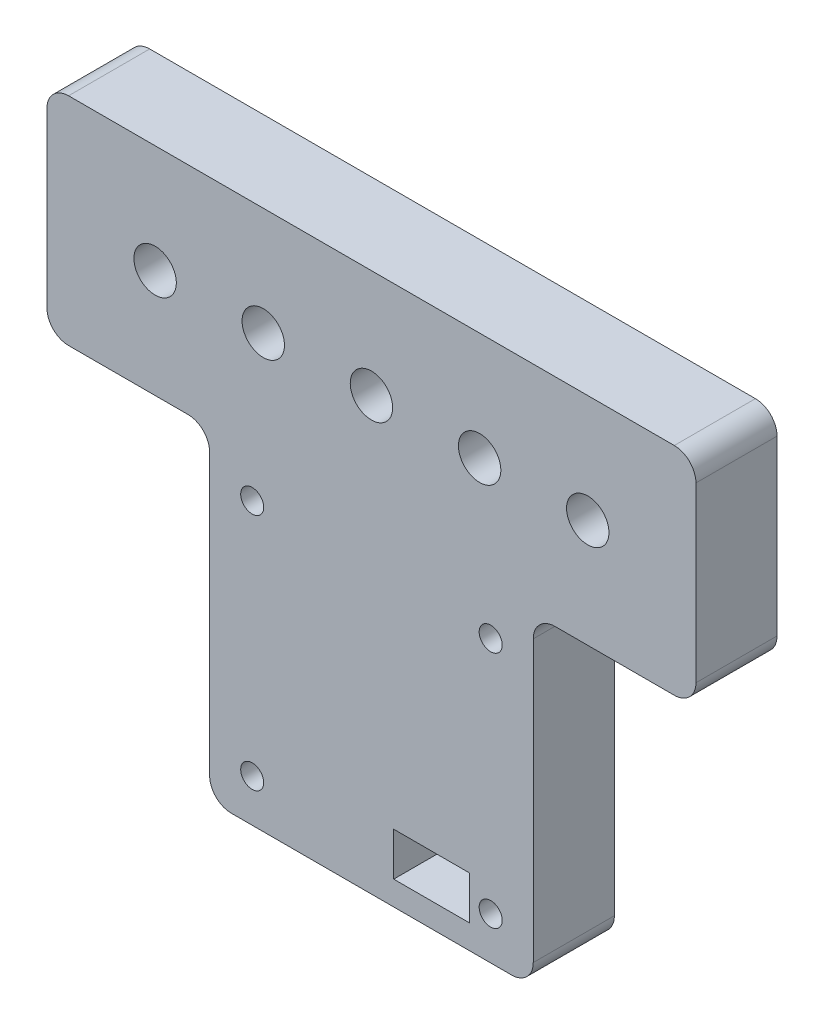
ISO-10303-21;
HEADER;
FILE_DESCRIPTION(('STEP AP214'),'2;1');
FILE_NAME('part.step','',(''),(''),'','','');
FILE_SCHEMA(('AUTOMOTIVE_DESIGN { 1 0 10303 214 1 1 1 1 }'));
ENDSEC;
DATA;
#1=APPLICATION_CONTEXT('core data for automotive mechanical design processes');
#2=APPLICATION_PROTOCOL_DEFINITION('international standard','automotive_design',2000,#1);
#3=PRODUCT_CONTEXT('',#1,'mechanical');
#4=PRODUCT('Part','Part','',(#3));
#5=PRODUCT_RELATED_PRODUCT_CATEGORY('part','',(#4));
#6=PRODUCT_DEFINITION_FORMATION('','',#4);
#7=PRODUCT_DEFINITION_CONTEXT('part definition',#1,'design');
#8=PRODUCT_DEFINITION('design','',#6,#7);
#9=PRODUCT_DEFINITION_SHAPE('','',#8);
#10=(LENGTH_UNIT() NAMED_UNIT(*) SI_UNIT(.MILLI.,.METRE.));
#11=(NAMED_UNIT(*) PLANE_ANGLE_UNIT() SI_UNIT($,.RADIAN.));
#12=(NAMED_UNIT(*) SI_UNIT($,.STERADIAN.) SOLID_ANGLE_UNIT());
#13=UNCERTAINTY_MEASURE_WITH_UNIT(LENGTH_MEASURE(1.E-05),#10,'distance_accuracy_value','');
#14=(GEOMETRIC_REPRESENTATION_CONTEXT(3) GLOBAL_UNCERTAINTY_ASSIGNED_CONTEXT((#13)) GLOBAL_UNIT_ASSIGNED_CONTEXT((#10,
#11,#12)) REPRESENTATION_CONTEXT('',''));
#15=CARTESIAN_POINT('',(0.,0.,0.));
#16=DIRECTION('',(0.,0.,1.));
#17=DIRECTION('',(1.,0.,0.));
#18=AXIS2_PLACEMENT_3D('',#15,#16,#17);
#19=CARTESIAN_POINT('',(0.,0.,0.));
#20=DIRECTION('',(0.,0.,-1.));
#21=DIRECTION('',(-1.,0.,0.));
#22=AXIS2_PLACEMENT_3D('',#19,#20,#21);
#23=PLANE('',#22);
#24=CARTESIAN_POINT('',(-25.4,31.7,0.));
#25=DIRECTION('',(0.,0.,-1.));
#26=DIRECTION('',(-1.,0.,0.));
#27=AXIS2_PLACEMENT_3D('',#24,#25,#26);
#28=CIRCLE('',#27,2.4892);
#29=CARTESIAN_POINT('',(-27.8892,31.7,0.));
#30=VERTEX_POINT('',#29);
#31=EDGE_CURVE('E523',#30,#30,#28,.T.);
#32=ORIENTED_EDGE('',*,*,#31,.F.);
#33=EDGE_LOOP('',(#32));
#34=FACE_BOUND('',#33,.T.);
#35=CARTESIAN_POINT('',(-12.7,31.7,0.));
#36=DIRECTION('',(0.,0.,-1.));
#37=DIRECTION('',(-1.,0.,0.));
#38=AXIS2_PLACEMENT_3D('',#35,#36,#37);
#39=CIRCLE('',#38,2.4892);
#40=CARTESIAN_POINT('',(-15.1892,31.7,0.));
#41=VERTEX_POINT('',#40);
#42=EDGE_CURVE('E515',#41,#41,#39,.T.);
#43=ORIENTED_EDGE('',*,*,#42,.F.);
#44=EDGE_LOOP('',(#43));
#45=FACE_BOUND('',#44,.T.);
#46=CARTESIAN_POINT('',(0.,31.7,0.));
#47=DIRECTION('',(0.,0.,-1.));
#48=DIRECTION('',(-1.,0.,0.));
#49=AXIS2_PLACEMENT_3D('',#46,#47,#48);
#50=CIRCLE('',#49,2.4892);
#51=CARTESIAN_POINT('',(-2.48919999999999,31.7,0.));
#52=VERTEX_POINT('',#51);
#53=EDGE_CURVE('E507',#52,#52,#50,.T.);
#54=ORIENTED_EDGE('',*,*,#53,.F.);
#55=EDGE_LOOP('',(#54));
#56=FACE_BOUND('',#55,.T.);
#57=CARTESIAN_POINT('',(12.7,31.7,0.));
#58=DIRECTION('',(0.,0.,-1.));
#59=DIRECTION('',(-1.,0.,0.));
#60=AXIS2_PLACEMENT_3D('',#57,#58,#59);
#61=CIRCLE('',#60,2.4892);
#62=CARTESIAN_POINT('',(10.2108,31.7,0.));
#63=VERTEX_POINT('',#62);
#64=EDGE_CURVE('E499',#63,#63,#61,.T.);
#65=ORIENTED_EDGE('',*,*,#64,.F.);
#66=EDGE_LOOP('',(#65));
#67=FACE_BOUND('',#66,.T.);
#68=CARTESIAN_POINT('',(25.4,31.7,0.));
#69=DIRECTION('',(0.,0.,-1.));
#70=DIRECTION('',(-1.,0.,0.));
#71=AXIS2_PLACEMENT_3D('',#68,#69,#70);
#72=CIRCLE('',#71,2.4892);
#73=CARTESIAN_POINT('',(22.9108,31.7,0.));
#74=VERTEX_POINT('',#73);
#75=EDGE_CURVE('E451',#74,#74,#72,.T.);
#76=ORIENTED_EDGE('',*,*,#75,.F.);
#77=EDGE_LOOP('',(#76));
#78=FACE_BOUND('',#77,.T.);
#79=DIRECTION('',(0.,-1.,0.));
#80=VECTOR('',#79,1.);
#81=CARTESIAN_POINT('',(11.50499991,-11.089999978,0.));
#82=LINE('',#81,#80);
#83=CARTESIAN_POINT('',(11.50499991,-11.089999978,0.));
#84=VERTEX_POINT('',#83);
#85=CARTESIAN_POINT('',(11.50499991,-16.169999978,0.));
#86=VERTEX_POINT('',#85);
#87=EDGE_CURVE('E191',#84,#86,#82,.T.);
#88=ORIENTED_EDGE('',*,*,#87,.F.);
#89=DIRECTION('',(1.,0.,0.));
#90=VECTOR('',#89,1.);
#91=CARTESIAN_POINT('',(2.61499991,-11.089999978,0.));
#92=LINE('',#91,#90);
#93=CARTESIAN_POINT('',(2.61499991,-11.089999978,0.));
#94=VERTEX_POINT('',#93);
#95=EDGE_CURVE('E212',#94,#84,#92,.T.);
#96=ORIENTED_EDGE('',*,*,#95,.F.);
#97=DIRECTION('',(0.,1.,0.));
#98=VECTOR('',#97,1.);
#99=CARTESIAN_POINT('',(2.61499991,-11.089999978,0.));
#100=LINE('',#99,#98);
#101=CARTESIAN_POINT('',(2.61499991,-16.169999978,0.));
#102=VERTEX_POINT('',#101);
#103=EDGE_CURVE('E216',#102,#94,#100,.T.);
#104=ORIENTED_EDGE('',*,*,#103,.F.);
#105=DIRECTION('',(-1.,0.,0.));
#106=VECTOR('',#105,1.);
#107=CARTESIAN_POINT('',(2.61499991,-16.169999978,0.));
#108=LINE('',#107,#106);
#109=EDGE_CURVE('E228',#86,#102,#108,.T.);
#110=ORIENTED_EDGE('',*,*,#109,.F.);
#111=EDGE_LOOP('',(#88,#96,#104,#110));
#112=FACE_BOUND('',#111,.T.);
#113=DIRECTION('',(0.,-1.,0.));
#114=VECTOR('',#113,1.);
#115=CARTESIAN_POINT('',(-38.1,44.4,0.));
#116=LINE('',#115,#114);
#117=CARTESIAN_POINT('',(-38.1,41.86,0.));
#118=VERTEX_POINT('',#117);
#119=CARTESIAN_POINT('',(-38.1,21.54,0.));
#120=VERTEX_POINT('',#119);
#121=EDGE_CURVE('E459',#118,#120,#116,.T.);
#122=ORIENTED_EDGE('',*,*,#121,.F.);
#123=CARTESIAN_POINT('',(-35.56,41.86,0.));
#124=DIRECTION('',(0.,0.,-1.));
#125=DIRECTION('',(-1.,0.,0.));
#126=AXIS2_PLACEMENT_3D('',#123,#124,#125);
#127=CIRCLE('',#126,2.54);
#128=CARTESIAN_POINT('',(-35.56,44.4,0.));
#129=VERTEX_POINT('',#128);
#130=EDGE_CURVE('E343',#118,#129,#127,.T.);
#131=ORIENTED_EDGE('',*,*,#130,.T.);
#132=DIRECTION('',(-1.,0.,0.));
#133=VECTOR('',#132,1.);
#134=CARTESIAN_POINT('',(-38.1,44.4,0.));
#135=LINE('',#134,#133);
#136=CARTESIAN_POINT('',(35.56,44.4,0.));
#137=VERTEX_POINT('',#136);
#138=EDGE_CURVE('E454',#137,#129,#135,.T.);
#139=ORIENTED_EDGE('',*,*,#138,.F.);
#140=CARTESIAN_POINT('',(35.56,41.86,0.));
#141=DIRECTION('',(0.,0.,-1.));
#142=DIRECTION('',(-1.,0.,0.));
#143=AXIS2_PLACEMENT_3D('',#140,#141,#142);
#144=CIRCLE('',#143,2.54);
#145=CARTESIAN_POINT('',(38.1,41.86,0.));
#146=VERTEX_POINT('',#145);
#147=EDGE_CURVE('E340',#137,#146,#144,.T.);
#148=ORIENTED_EDGE('',*,*,#147,.T.);
#149=DIRECTION('',(0.,-1.,0.));
#150=VECTOR('',#149,1.);
#151=CARTESIAN_POINT('',(38.1,44.4,0.));
#152=LINE('',#151,#150);
#153=CARTESIAN_POINT('',(38.1,21.54,0.));
#154=VERTEX_POINT('',#153);
#155=EDGE_CURVE('E463',#146,#154,#152,.T.);
#156=ORIENTED_EDGE('',*,*,#155,.T.);
#157=CARTESIAN_POINT('',(35.56,21.54,0.));
#158=DIRECTION('',(0.,0.,-1.));
#159=DIRECTION('',(-1.,0.,0.));
#160=AXIS2_PLACEMENT_3D('',#157,#158,#159);
#161=CIRCLE('',#160,2.54);
#162=CARTESIAN_POINT('',(35.56,19.,0.));
#163=VERTEX_POINT('',#162);
#164=EDGE_CURVE('E337',#154,#163,#161,.T.);
#165=ORIENTED_EDGE('',*,*,#164,.T.);
#166=DIRECTION('',(-1.,0.,0.));
#167=VECTOR('',#166,1.);
#168=CARTESIAN_POINT('',(-38.1,19.,0.));
#169=LINE('',#168,#167);
#170=CARTESIAN_POINT('',(21.54,19.,0.));
#171=VERTEX_POINT('',#170);
#172=EDGE_CURVE('E408',#163,#171,#169,.T.);
#173=ORIENTED_EDGE('',*,*,#172,.T.);
#174=CARTESIAN_POINT('',(21.54,16.46,0.));
#175=DIRECTION('',(0.,0.,-1.));
#176=DIRECTION('',(-1.,0.,0.));
#177=AXIS2_PLACEMENT_3D('',#174,#175,#176);
#178=CIRCLE('',#177,2.54);
#179=CARTESIAN_POINT('',(19.,16.46,0.));
#180=VERTEX_POINT('',#179);
#181=EDGE_CURVE('E386',#171,#180,#178,.F.);
#182=ORIENTED_EDGE('',*,*,#181,.T.);
#183=DIRECTION('',(0.,1.,0.));
#184=VECTOR('',#183,1.);
#185=CARTESIAN_POINT('',(19.,-19.,0.));
#186=LINE('',#185,#184);
#187=CARTESIAN_POINT('',(19.,-16.46,0.));
#188=VERTEX_POINT('',#187);
#189=EDGE_CURVE('E280',#188,#180,#186,.T.);
#190=ORIENTED_EDGE('',*,*,#189,.F.);
#191=CARTESIAN_POINT('',(16.46,-16.46,0.));
#192=DIRECTION('',(0.,0.,-1.));
#193=DIRECTION('',(-1.,0.,0.));
#194=AXIS2_PLACEMENT_3D('',#191,#192,#193);
#195=CIRCLE('',#194,2.54);
#196=CARTESIAN_POINT('',(16.46,-19.,0.));
#197=VERTEX_POINT('',#196);
#198=EDGE_CURVE('E61',#188,#197,#195,.T.);
#199=ORIENTED_EDGE('',*,*,#198,.T.);
#200=DIRECTION('',(1.,0.,0.));
#201=VECTOR('',#200,1.);
#202=CARTESIAN_POINT('',(19.,-19.,0.));
#203=LINE('',#202,#201);
#204=CARTESIAN_POINT('',(-16.46,-19.,0.));
#205=VERTEX_POINT('',#204);
#206=EDGE_CURVE('E292',#205,#197,#203,.T.);
#207=ORIENTED_EDGE('',*,*,#206,.F.);
#208=CARTESIAN_POINT('',(-16.46,-16.46,0.));
#209=DIRECTION('',(0.,0.,-1.));
#210=DIRECTION('',(-1.,0.,0.));
#211=AXIS2_PLACEMENT_3D('',#208,#209,#210);
#212=CIRCLE('',#211,2.54);
#213=CARTESIAN_POINT('',(-19.,-16.46,0.));
#214=VERTEX_POINT('',#213);
#215=EDGE_CURVE('E69',#205,#214,#212,.T.);
#216=ORIENTED_EDGE('',*,*,#215,.T.);
#217=DIRECTION('',(0.,-1.,0.));
#218=VECTOR('',#217,1.);
#219=CARTESIAN_POINT('',(-19.,-19.,0.));
#220=LINE('',#219,#218);
#221=CARTESIAN_POINT('',(-19.,16.46,0.));
#222=VERTEX_POINT('',#221);
#223=EDGE_CURVE('E274',#222,#214,#220,.T.);
#224=ORIENTED_EDGE('',*,*,#223,.F.);
#225=CARTESIAN_POINT('',(-21.54,16.46,0.));
#226=DIRECTION('',(0.,0.,-1.));
#227=DIRECTION('',(-1.,0.,0.));
#228=AXIS2_PLACEMENT_3D('',#225,#226,#227);
#229=CIRCLE('',#228,2.54);
#230=CARTESIAN_POINT('',(-21.54,19.,0.));
#231=VERTEX_POINT('',#230);
#232=EDGE_CURVE('E54',#222,#231,#229,.F.);
#233=ORIENTED_EDGE('',*,*,#232,.T.);
#234=CARTESIAN_POINT('',(-35.56,19.,0.));
#235=VERTEX_POINT('',#234);
#236=EDGE_CURVE('E397',#231,#235,#169,.T.);
#237=ORIENTED_EDGE('',*,*,#236,.T.);
#238=CARTESIAN_POINT('',(-35.56,21.54,0.));
#239=DIRECTION('',(0.,0.,-1.));
#240=DIRECTION('',(-1.,0.,0.));
#241=AXIS2_PLACEMENT_3D('',#238,#239,#240);
#242=CIRCLE('',#241,2.54);
#243=EDGE_CURVE('E330',#235,#120,#242,.T.);
#244=ORIENTED_EDGE('',*,*,#243,.T.);
#245=EDGE_LOOP('',(#122,#131,#139,#148,#156,#165,#173,#182,#190,#199,#207,#216,#224,#233,#237,#244));
#246=FACE_BOUND('',#245,.T.);
#247=CARTESIAN_POINT('',(-14.,14.,0.));
#248=DIRECTION('',(0.,0.,1.));
#249=DIRECTION('',(1.,0.,0.));
#250=AXIS2_PLACEMENT_3D('',#247,#248,#249);
#251=CIRCLE('',#250,1.35255);
#252=CARTESIAN_POINT('',(-12.64745,14.,0.));
#253=VERTEX_POINT('',#252);
#254=EDGE_CURVE('E270',#253,#253,#251,.T.);
#255=ORIENTED_EDGE('',*,*,#254,.T.);
#256=EDGE_LOOP('',(#255));
#257=FACE_BOUND('',#256,.T.);
#258=CARTESIAN_POINT('',(14.,14.,0.));
#259=DIRECTION('',(0.,0.,1.));
#260=DIRECTION('',(1.,0.,0.));
#261=AXIS2_PLACEMENT_3D('',#258,#259,#260);
#262=CIRCLE('',#261,1.35255);
#263=CARTESIAN_POINT('',(15.35255,14.,0.));
#264=VERTEX_POINT('',#263);
#265=EDGE_CURVE('E262',#264,#264,#262,.T.);
#266=ORIENTED_EDGE('',*,*,#265,.T.);
#267=EDGE_LOOP('',(#266));
#268=FACE_BOUND('',#267,.T.);
#269=CARTESIAN_POINT('',(14.,-14.,0.));
#270=DIRECTION('',(0.,0.,1.));
#271=DIRECTION('',(1.,0.,0.));
#272=AXIS2_PLACEMENT_3D('',#269,#270,#271);
#273=CIRCLE('',#272,1.35255);
#274=CARTESIAN_POINT('',(15.35255,-14.,0.));
#275=VERTEX_POINT('',#274);
#276=EDGE_CURVE('E254',#275,#275,#273,.T.);
#277=ORIENTED_EDGE('',*,*,#276,.T.);
#278=EDGE_LOOP('',(#277));
#279=FACE_BOUND('',#278,.T.);
#280=CARTESIAN_POINT('',(-14.,-14.,0.));
#281=DIRECTION('',(0.,0.,1.));
#282=DIRECTION('',(1.,0.,0.));
#283=AXIS2_PLACEMENT_3D('',#280,#281,#282);
#284=CIRCLE('',#283,1.35255);
#285=CARTESIAN_POINT('',(-12.64745,-14.,0.));
#286=VERTEX_POINT('',#285);
#287=EDGE_CURVE('E246',#286,#286,#284,.T.);
#288=ORIENTED_EDGE('',*,*,#287,.T.);
#289=EDGE_LOOP('',(#288));
#290=FACE_BOUND('',#289,.T.);
#291=ADVANCED_FACE('F45',(#34,#45,#56,#67,#78,#112,#246,#257,#268,#279,#290),#23,.T.);
#292=CARTESIAN_POINT('',(-19.,-19.,9.525));
#293=DIRECTION('',(1.,0.,0.));
#294=DIRECTION('',(0.,0.,-1.));
#295=AXIS2_PLACEMENT_3D('',#292,#293,#294);
#296=PLANE('',#295);
#297=ORIENTED_EDGE('',*,*,#223,.T.);
#298=DIRECTION('',(0.,0.,-1.));
#299=VECTOR('',#298,1.);
#300=CARTESIAN_POINT('',(-19.,-16.46,9.525));
#301=LINE('',#300,#299);
#302=CARTESIAN_POINT('',(-19.,-16.46,9.525));
#303=VERTEX_POINT('',#302);
#304=EDGE_CURVE('E377',#214,#303,#301,.F.);
#305=ORIENTED_EDGE('',*,*,#304,.T.);
#306=DIRECTION('',(0.,-1.,0.));
#307=VECTOR('',#306,1.);
#308=CARTESIAN_POINT('',(-19.,-19.,9.525));
#309=LINE('',#308,#307);
#310=CARTESIAN_POINT('',(-19.,16.46,9.525));
#311=VERTEX_POINT('',#310);
#312=EDGE_CURVE('E275',#311,#303,#309,.T.);
#313=ORIENTED_EDGE('',*,*,#312,.F.);
#314=DIRECTION('',(0.,0.,-1.));
#315=VECTOR('',#314,1.);
#316=CARTESIAN_POINT('',(-19.,16.46,9.525));
#317=LINE('',#316,#315);
#318=EDGE_CURVE('E373',#311,#222,#317,.T.);
#319=ORIENTED_EDGE('',*,*,#318,.T.);
#320=EDGE_LOOP('',(#297,#305,#313,#319));
#321=FACE_BOUND('',#320,.T.);
#322=ADVANCED_FACE('F418',(#321),#296,.F.);
#323=CARTESIAN_POINT('',(19.,-19.,9.525));
#324=DIRECTION('',(0.,1.,0.));
#325=DIRECTION('',(0.,0.,1.));
#326=AXIS2_PLACEMENT_3D('',#323,#324,#325);
#327=PLANE('',#326);
#328=ORIENTED_EDGE('',*,*,#206,.T.);
#329=DIRECTION('',(0.,0.,-1.));
#330=VECTOR('',#329,1.);
#331=CARTESIAN_POINT('',(16.46,-19.,9.525));
#332=LINE('',#331,#330);
#333=CARTESIAN_POINT('',(16.46,-19.,9.525));
#334=VERTEX_POINT('',#333);
#335=EDGE_CURVE('E370',#197,#334,#332,.F.);
#336=ORIENTED_EDGE('',*,*,#335,.T.);
#337=DIRECTION('',(1.,0.,0.));
#338=VECTOR('',#337,1.);
#339=CARTESIAN_POINT('',(19.,-19.,9.525));
#340=LINE('',#339,#338);
#341=CARTESIAN_POINT('',(-16.46,-19.,9.525));
#342=VERTEX_POINT('',#341);
#343=EDGE_CURVE('E279',#342,#334,#340,.T.);
#344=ORIENTED_EDGE('',*,*,#343,.F.);
#345=DIRECTION('',(0.,0.,-1.));
#346=VECTOR('',#345,1.);
#347=CARTESIAN_POINT('',(-16.46,-19.,9.525));
#348=LINE('',#347,#346);
#349=EDGE_CURVE('E367',#342,#205,#348,.T.);
#350=ORIENTED_EDGE('',*,*,#349,.T.);
#351=EDGE_LOOP('',(#328,#336,#344,#350));
#352=FACE_BOUND('',#351,.T.);
#353=ADVANCED_FACE('F423',(#352),#327,.F.);
#354=CARTESIAN_POINT('',(19.,-19.,9.525));
#355=DIRECTION('',(-1.,0.,0.));
#356=DIRECTION('',(0.,0.,1.));
#357=AXIS2_PLACEMENT_3D('',#354,#355,#356);
#358=PLANE('',#357);
#359=ORIENTED_EDGE('',*,*,#189,.T.);
#360=DIRECTION('',(0.,0.,-1.));
#361=VECTOR('',#360,1.);
#362=CARTESIAN_POINT('',(19.,16.46,9.525));
#363=LINE('',#362,#361);
#364=CARTESIAN_POINT('',(19.,16.46,9.525));
#365=VERTEX_POINT('',#364);
#366=EDGE_CURVE('E364',#180,#365,#363,.F.);
#367=ORIENTED_EDGE('',*,*,#366,.T.);
#368=DIRECTION('',(0.,1.,0.));
#369=VECTOR('',#368,1.);
#370=CARTESIAN_POINT('',(19.,-19.,9.525));
#371=LINE('',#370,#369);
#372=CARTESIAN_POINT('',(19.,-16.46,9.525));
#373=VERTEX_POINT('',#372);
#374=EDGE_CURVE('E284',#373,#365,#371,.T.);
#375=ORIENTED_EDGE('',*,*,#374,.F.);
#376=DIRECTION('',(0.,0.,-1.));
#377=VECTOR('',#376,1.);
#378=CARTESIAN_POINT('',(19.,-16.46,9.525));
#379=LINE('',#378,#377);
#380=EDGE_CURVE('E360',#373,#188,#379,.T.);
#381=ORIENTED_EDGE('',*,*,#380,.T.);
#382=EDGE_LOOP('',(#359,#367,#375,#381));
#383=FACE_BOUND('',#382,.T.);
#384=ADVANCED_FACE('F431',(#383),#358,.F.);
#385=CARTESIAN_POINT('',(0.,0.,9.525));
#386=DIRECTION('',(0.,0.,-1.));
#387=DIRECTION('',(-1.,0.,0.));
#388=AXIS2_PLACEMENT_3D('',#385,#386,#387);
#389=PLANE('',#388);
#390=CARTESIAN_POINT('',(-25.4,31.7,9.525));
#391=DIRECTION('',(0.,0.,-1.));
#392=DIRECTION('',(-1.,0.,0.));
#393=AXIS2_PLACEMENT_3D('',#390,#391,#392);
#394=CIRCLE('',#393,2.4892);
#395=CARTESIAN_POINT('',(-27.8892,31.7,9.525));
#396=VERTEX_POINT('',#395);
#397=EDGE_CURVE('E519',#396,#396,#394,.T.);
#398=ORIENTED_EDGE('',*,*,#397,.T.);
#399=EDGE_LOOP('',(#398));
#400=FACE_BOUND('',#399,.T.);
#401=CARTESIAN_POINT('',(-12.7,31.7,9.525));
#402=DIRECTION('',(0.,0.,-1.));
#403=DIRECTION('',(-1.,0.,0.));
#404=AXIS2_PLACEMENT_3D('',#401,#402,#403);
#405=CIRCLE('',#404,2.4892);
#406=CARTESIAN_POINT('',(-15.1892,31.7,9.525));
#407=VERTEX_POINT('',#406);
#408=EDGE_CURVE('E511',#407,#407,#405,.T.);
#409=ORIENTED_EDGE('',*,*,#408,.T.);
#410=EDGE_LOOP('',(#409));
#411=FACE_BOUND('',#410,.T.);
#412=CARTESIAN_POINT('',(0.,31.7,9.525));
#413=DIRECTION('',(0.,0.,-1.));
#414=DIRECTION('',(-1.,0.,0.));
#415=AXIS2_PLACEMENT_3D('',#412,#413,#414);
#416=CIRCLE('',#415,2.4892);
#417=CARTESIAN_POINT('',(-2.48919999999999,31.7,9.525));
#418=VERTEX_POINT('',#417);
#419=EDGE_CURVE('E503',#418,#418,#416,.T.);
#420=ORIENTED_EDGE('',*,*,#419,.T.);
#421=EDGE_LOOP('',(#420));
#422=FACE_BOUND('',#421,.T.);
#423=CARTESIAN_POINT('',(12.7,31.7,9.525));
#424=DIRECTION('',(0.,0.,-1.));
#425=DIRECTION('',(-1.,0.,0.));
#426=AXIS2_PLACEMENT_3D('',#423,#424,#425);
#427=CIRCLE('',#426,2.4892);
#428=CARTESIAN_POINT('',(10.2108,31.7,9.525));
#429=VERTEX_POINT('',#428);
#430=EDGE_CURVE('E495',#429,#429,#427,.T.);
#431=ORIENTED_EDGE('',*,*,#430,.T.);
#432=EDGE_LOOP('',(#431));
#433=FACE_BOUND('',#432,.T.);
#434=CARTESIAN_POINT('',(25.4,31.7,9.525));
#435=DIRECTION('',(0.,0.,-1.));
#436=DIRECTION('',(-1.,0.,0.));
#437=AXIS2_PLACEMENT_3D('',#434,#435,#436);
#438=CIRCLE('',#437,2.4892);
#439=CARTESIAN_POINT('',(22.9108,31.7,9.525));
#440=VERTEX_POINT('',#439);
#441=EDGE_CURVE('E446',#440,#440,#438,.T.);
#442=ORIENTED_EDGE('',*,*,#441,.T.);
#443=EDGE_LOOP('',(#442));
#444=FACE_BOUND('',#443,.T.);
#445=DIRECTION('',(1.,0.,0.));
#446=VECTOR('',#445,1.);
#447=CARTESIAN_POINT('',(2.61499991,-11.089999978,9.525));
#448=LINE('',#447,#446);
#449=CARTESIAN_POINT('',(2.61499991,-11.089999978,9.525));
#450=VERTEX_POINT('',#449);
#451=CARTESIAN_POINT('',(11.50499991,-11.089999978,9.525));
#452=VERTEX_POINT('',#451);
#453=EDGE_CURVE('E197',#450,#452,#448,.T.);
#454=ORIENTED_EDGE('',*,*,#453,.T.);
#455=DIRECTION('',(0.,-1.,0.));
#456=VECTOR('',#455,1.);
#457=CARTESIAN_POINT('',(11.50499991,-11.089999978,9.525));
#458=LINE('',#457,#456);
#459=CARTESIAN_POINT('',(11.50499991,-16.169999978,9.525));
#460=VERTEX_POINT('',#459);
#461=EDGE_CURVE('E188',#452,#460,#458,.T.);
#462=ORIENTED_EDGE('',*,*,#461,.T.);
#463=DIRECTION('',(-1.,0.,0.));
#464=VECTOR('',#463,1.);
#465=CARTESIAN_POINT('',(2.61499991,-16.169999978,9.525));
#466=LINE('',#465,#464);
#467=CARTESIAN_POINT('',(2.61499991,-16.169999978,9.525));
#468=VERTEX_POINT('',#467);
#469=EDGE_CURVE('E201',#460,#468,#466,.T.);
#470=ORIENTED_EDGE('',*,*,#469,.T.);
#471=DIRECTION('',(0.,1.,0.));
#472=VECTOR('',#471,1.);
#473=CARTESIAN_POINT('',(2.61499991,-11.089999978,9.525));
#474=LINE('',#473,#472);
#475=EDGE_CURVE('E206',#468,#450,#474,.T.);
#476=ORIENTED_EDGE('',*,*,#475,.T.);
#477=EDGE_LOOP('',(#454,#462,#470,#476));
#478=FACE_BOUND('',#477,.T.);
#479=CARTESIAN_POINT('',(-14.,-14.,9.525));
#480=DIRECTION('',(0.,0.,1.));
#481=DIRECTION('',(1.,0.,0.));
#482=AXIS2_PLACEMENT_3D('',#479,#480,#481);
#483=CIRCLE('',#482,1.35254999999999);
#484=CARTESIAN_POINT('',(-12.64745,-14.,9.525));
#485=VERTEX_POINT('',#484);
#486=EDGE_CURVE('E237',#485,#485,#483,.T.);
#487=ORIENTED_EDGE('',*,*,#486,.F.);
#488=EDGE_LOOP('',(#487));
#489=FACE_BOUND('',#488,.T.);
#490=CARTESIAN_POINT('',(14.,-14.,9.525));
#491=DIRECTION('',(0.,0.,1.));
#492=DIRECTION('',(1.,0.,0.));
#493=AXIS2_PLACEMENT_3D('',#490,#491,#492);
#494=CIRCLE('',#493,1.35254999999999);
#495=CARTESIAN_POINT('',(15.35255,-14.,9.525));
#496=VERTEX_POINT('',#495);
#497=EDGE_CURVE('E250',#496,#496,#494,.T.);
#498=ORIENTED_EDGE('',*,*,#497,.F.);
#499=EDGE_LOOP('',(#498));
#500=FACE_BOUND('',#499,.T.);
#501=CARTESIAN_POINT('',(14.,14.,9.525));
#502=DIRECTION('',(0.,0.,1.));
#503=DIRECTION('',(1.,0.,0.));
#504=AXIS2_PLACEMENT_3D('',#501,#502,#503);
#505=CIRCLE('',#504,1.35254999999999);
#506=CARTESIAN_POINT('',(15.35255,14.,9.525));
#507=VERTEX_POINT('',#506);
#508=EDGE_CURVE('E258',#507,#507,#505,.T.);
#509=ORIENTED_EDGE('',*,*,#508,.F.);
#510=EDGE_LOOP('',(#509));
#511=FACE_BOUND('',#510,.T.);
#512=CARTESIAN_POINT('',(-14.,14.,9.525));
#513=DIRECTION('',(0.,0.,1.));
#514=DIRECTION('',(1.,0.,0.));
#515=AXIS2_PLACEMENT_3D('',#512,#513,#514);
#516=CIRCLE('',#515,1.35254999999999);
#517=CARTESIAN_POINT('',(-12.64745,14.,9.525));
#518=VERTEX_POINT('',#517);
#519=EDGE_CURVE('E266',#518,#518,#516,.T.);
#520=ORIENTED_EDGE('',*,*,#519,.F.);
#521=EDGE_LOOP('',(#520));
#522=FACE_BOUND('',#521,.T.);
#523=DIRECTION('',(1.,0.,0.));
#524=VECTOR('',#523,1.);
#525=CARTESIAN_POINT('',(-38.1,44.4,9.525));
#526=LINE('',#525,#524);
#527=CARTESIAN_POINT('',(-35.56,44.4,9.525));
#528=VERTEX_POINT('',#527);
#529=CARTESIAN_POINT('',(35.56,44.4,9.52499999999998));
#530=VERTEX_POINT('',#529);
#531=EDGE_CURVE('E458',#528,#530,#526,.T.);
#532=ORIENTED_EDGE('',*,*,#531,.F.);
#533=CARTESIAN_POINT('',(-35.56,41.86,9.525));
#534=DIRECTION('',(0.,0.,-1.));
#535=DIRECTION('',(-1.,0.,0.));
#536=AXIS2_PLACEMENT_3D('',#533,#534,#535);
#537=CIRCLE('',#536,2.54);
#538=CARTESIAN_POINT('',(-38.1,41.86,9.525));
#539=VERTEX_POINT('',#538);
#540=EDGE_CURVE('E320',#528,#539,#537,.F.);
#541=ORIENTED_EDGE('',*,*,#540,.T.);
#542=DIRECTION('',(0.,-1.,0.));
#543=VECTOR('',#542,1.);
#544=CARTESIAN_POINT('',(-38.1,44.4,9.525));
#545=LINE('',#544,#543);
#546=CARTESIAN_POINT('',(-38.1,21.54,9.525));
#547=VERTEX_POINT('',#546);
#548=EDGE_CURVE('E219',#539,#547,#545,.T.);
#549=ORIENTED_EDGE('',*,*,#548,.T.);
#550=CARTESIAN_POINT('',(-35.56,21.54,9.525));
#551=DIRECTION('',(0.,0.,-1.));
#552=DIRECTION('',(-1.,0.,0.));
#553=AXIS2_PLACEMENT_3D('',#550,#551,#552);
#554=CIRCLE('',#553,2.54);
#555=CARTESIAN_POINT('',(-35.56,19.,9.525));
#556=VERTEX_POINT('',#555);
#557=EDGE_CURVE('E305',#547,#556,#554,.F.);
#558=ORIENTED_EDGE('',*,*,#557,.T.);
#559=DIRECTION('',(1.,0.,0.));
#560=VECTOR('',#559,1.);
#561=CARTESIAN_POINT('',(-38.1,19.,9.525));
#562=LINE('',#561,#560);
#563=CARTESIAN_POINT('',(-21.54,19.,9.525));
#564=VERTEX_POINT('',#563);
#565=EDGE_CURVE('E409',#556,#564,#562,.T.);
#566=ORIENTED_EDGE('',*,*,#565,.T.);
#567=CARTESIAN_POINT('',(-21.54,16.46,9.525));
#568=DIRECTION('',(0.,0.,-1.));
#569=DIRECTION('',(-1.,0.,0.));
#570=AXIS2_PLACEMENT_3D('',#567,#568,#569);
#571=CIRCLE('',#570,2.54);
#572=EDGE_CURVE('E11',#564,#311,#571,.T.);
#573=ORIENTED_EDGE('',*,*,#572,.T.);
#574=ORIENTED_EDGE('',*,*,#312,.T.);
#575=CARTESIAN_POINT('',(-16.46,-16.46,9.525));
#576=DIRECTION('',(0.,0.,-1.));
#577=DIRECTION('',(-1.,0.,0.));
#578=AXIS2_PLACEMENT_3D('',#575,#576,#577);
#579=CIRCLE('',#578,2.54);
#580=EDGE_CURVE('E308',#303,#342,#579,.F.);
#581=ORIENTED_EDGE('',*,*,#580,.T.);
#582=ORIENTED_EDGE('',*,*,#343,.T.);
#583=CARTESIAN_POINT('',(16.46,-16.46,9.525));
#584=DIRECTION('',(0.,0.,-1.));
#585=DIRECTION('',(-1.,0.,0.));
#586=AXIS2_PLACEMENT_3D('',#583,#584,#585);
#587=CIRCLE('',#586,2.54);
#588=EDGE_CURVE('E311',#334,#373,#587,.F.);
#589=ORIENTED_EDGE('',*,*,#588,.T.);
#590=ORIENTED_EDGE('',*,*,#374,.T.);
#591=CARTESIAN_POINT('',(21.54,16.46,9.525));
#592=DIRECTION('',(0.,0.,-1.));
#593=DIRECTION('',(-1.,0.,0.));
#594=AXIS2_PLACEMENT_3D('',#591,#592,#593);
#595=CIRCLE('',#594,2.54);
#596=CARTESIAN_POINT('',(21.54,19.,9.52499999999998));
#597=VERTEX_POINT('',#596);
#598=EDGE_CURVE('E389',#365,#597,#595,.T.);
#599=ORIENTED_EDGE('',*,*,#598,.T.);
#600=CARTESIAN_POINT('',(35.56,19.,9.52499999999998));
#601=VERTEX_POINT('',#600);
#602=EDGE_CURVE('E438',#597,#601,#562,.T.);
#603=ORIENTED_EDGE('',*,*,#602,.T.);
#604=CARTESIAN_POINT('',(35.56,21.54,9.525));
#605=DIRECTION('',(0.,0.,-1.));
#606=DIRECTION('',(-1.,0.,0.));
#607=AXIS2_PLACEMENT_3D('',#604,#605,#606);
#608=CIRCLE('',#607,2.54);
#609=CARTESIAN_POINT('',(38.1,21.54,9.52499999999998));
#610=VERTEX_POINT('',#609);
#611=EDGE_CURVE('E314',#601,#610,#608,.F.);
#612=ORIENTED_EDGE('',*,*,#611,.T.);
#613=DIRECTION('',(0.,-1.,0.));
#614=VECTOR('',#613,1.);
#615=CARTESIAN_POINT('',(38.1,44.4,9.52499999999998));
#616=LINE('',#615,#614);
#617=CARTESIAN_POINT('',(38.1,41.86,9.52499999999998));
#618=VERTEX_POINT('',#617);
#619=EDGE_CURVE('E466',#618,#610,#616,.T.);
#620=ORIENTED_EDGE('',*,*,#619,.F.);
#621=CARTESIAN_POINT('',(35.56,41.86,9.525));
#622=DIRECTION('',(0.,0.,-1.));
#623=DIRECTION('',(-1.,0.,0.));
#624=AXIS2_PLACEMENT_3D('',#621,#622,#623);
#625=CIRCLE('',#624,2.54);
#626=EDGE_CURVE('E317',#618,#530,#625,.F.);
#627=ORIENTED_EDGE('',*,*,#626,.T.);
#628=EDGE_LOOP('',(#532,#541,#549,#558,#566,#573,#574,#581,#582,#589,#590,#599,#603,#612,#620,#627));
#629=FACE_BOUND('',#628,.T.);
#630=ADVANCED_FACE('F208',(#400,#411,#422,#433,#444,#478,#489,#500,#511,#522,#629),#389,.F.);
#631=CARTESIAN_POINT('',(-14.,14.,9.525));
#632=DIRECTION('',(0.,0.,1.));
#633=DIRECTION('',(1.,0.,0.));
#634=AXIS2_PLACEMENT_3D('',#631,#632,#633);
#635=CYLINDRICAL_SURFACE('',#634,1.35254999999999);
#636=ORIENTED_EDGE('',*,*,#254,.F.);
#637=EDGE_LOOP('',(#636));
#638=FACE_BOUND('',#637,.T.);
#639=ORIENTED_EDGE('',*,*,#519,.T.);
#640=EDGE_LOOP('',(#639));
#641=FACE_BOUND('',#640,.T.);
#642=ADVANCED_FACE('F571',(#638,#641),#635,.F.);
#643=CARTESIAN_POINT('',(14.,14.,9.525));
#644=DIRECTION('',(0.,0.,1.));
#645=DIRECTION('',(1.,0.,0.));
#646=AXIS2_PLACEMENT_3D('',#643,#644,#645);
#647=CYLINDRICAL_SURFACE('',#646,1.35254999999999);
#648=ORIENTED_EDGE('',*,*,#265,.F.);
#649=EDGE_LOOP('',(#648));
#650=FACE_BOUND('',#649,.T.);
#651=ORIENTED_EDGE('',*,*,#508,.T.);
#652=EDGE_LOOP('',(#651));
#653=FACE_BOUND('',#652,.T.);
#654=ADVANCED_FACE('F567',(#650,#653),#647,.F.);
#655=CARTESIAN_POINT('',(14.,-14.,9.525));
#656=DIRECTION('',(0.,0.,1.));
#657=DIRECTION('',(1.,0.,0.));
#658=AXIS2_PLACEMENT_3D('',#655,#656,#657);
#659=CYLINDRICAL_SURFACE('',#658,1.35254999999999);
#660=ORIENTED_EDGE('',*,*,#276,.F.);
#661=EDGE_LOOP('',(#660));
#662=FACE_BOUND('',#661,.T.);
#663=ORIENTED_EDGE('',*,*,#497,.T.);
#664=EDGE_LOOP('',(#663));
#665=FACE_BOUND('',#664,.T.);
#666=ADVANCED_FACE('F563',(#662,#665),#659,.F.);
#667=CARTESIAN_POINT('',(-14.,-14.,9.525));
#668=DIRECTION('',(0.,0.,1.));
#669=DIRECTION('',(1.,0.,0.));
#670=AXIS2_PLACEMENT_3D('',#667,#668,#669);
#671=CYLINDRICAL_SURFACE('',#670,1.35254999999999);
#672=ORIENTED_EDGE('',*,*,#287,.F.);
#673=EDGE_LOOP('',(#672));
#674=FACE_BOUND('',#673,.T.);
#675=ORIENTED_EDGE('',*,*,#486,.T.);
#676=EDGE_LOOP('',(#675));
#677=FACE_BOUND('',#676,.T.);
#678=ADVANCED_FACE('F554',(#674,#677),#671,.F.);
#679=CARTESIAN_POINT('',(11.50499991,-11.089999978,9.525));
#680=DIRECTION('',(1.,0.,0.));
#681=DIRECTION('',(0.,0.,-1.));
#682=AXIS2_PLACEMENT_3D('',#679,#680,#681);
#683=PLANE('',#682);
#684=ORIENTED_EDGE('',*,*,#87,.T.);
#685=DIRECTION('',(0.,0.,-1.));
#686=VECTOR('',#685,1.);
#687=CARTESIAN_POINT('',(11.50499991,-16.169999978,9.525));
#688=LINE('',#687,#686);
#689=EDGE_CURVE('E184',#460,#86,#688,.T.);
#690=ORIENTED_EDGE('',*,*,#689,.F.);
#691=ORIENTED_EDGE('',*,*,#461,.F.);
#692=DIRECTION('',(0.,0.,-1.));
#693=VECTOR('',#692,1.);
#694=CARTESIAN_POINT('',(11.50499991,-11.089999978,9.525));
#695=LINE('',#694,#693);
#696=EDGE_CURVE('E234',#452,#84,#695,.T.);
#697=ORIENTED_EDGE('',*,*,#696,.T.);
#698=EDGE_LOOP('',(#684,#690,#691,#697));
#699=FACE_BOUND('',#698,.T.);
#700=ADVANCED_FACE('F186',(#699),#683,.F.);
#701=CARTESIAN_POINT('',(2.61499991,-11.089999978,9.525));
#702=DIRECTION('',(0.,1.,0.));
#703=DIRECTION('',(0.,0.,1.));
#704=AXIS2_PLACEMENT_3D('',#701,#702,#703);
#705=PLANE('',#704);
#706=ORIENTED_EDGE('',*,*,#95,.T.);
#707=ORIENTED_EDGE('',*,*,#696,.F.);
#708=ORIENTED_EDGE('',*,*,#453,.F.);
#709=DIRECTION('',(0.,0.,-1.));
#710=VECTOR('',#709,1.);
#711=CARTESIAN_POINT('',(2.61499991,-11.089999978,9.525));
#712=LINE('',#711,#710);
#713=EDGE_CURVE('E238',#450,#94,#712,.T.);
#714=ORIENTED_EDGE('',*,*,#713,.T.);
#715=EDGE_LOOP('',(#706,#707,#708,#714));
#716=FACE_BOUND('',#715,.T.);
#717=ADVANCED_FACE('F546',(#716),#705,.F.);
#718=CARTESIAN_POINT('',(2.61499991,-11.089999978,9.525));
#719=DIRECTION('',(-1.,0.,0.));
#720=DIRECTION('',(0.,0.,1.));
#721=AXIS2_PLACEMENT_3D('',#718,#719,#720);
#722=PLANE('',#721);
#723=ORIENTED_EDGE('',*,*,#103,.T.);
#724=ORIENTED_EDGE('',*,*,#713,.F.);
#725=ORIENTED_EDGE('',*,*,#475,.F.);
#726=DIRECTION('',(0.,0.,-1.));
#727=VECTOR('',#726,1.);
#728=CARTESIAN_POINT('',(2.61499991,-16.169999978,9.525));
#729=LINE('',#728,#727);
#730=EDGE_CURVE('E196',#468,#102,#729,.T.);
#731=ORIENTED_EDGE('',*,*,#730,.T.);
#732=EDGE_LOOP('',(#723,#724,#725,#731));
#733=FACE_BOUND('',#732,.T.);
#734=ADVANCED_FACE('F544',(#733),#722,.F.);
#735=CARTESIAN_POINT('',(2.61499991,-16.169999978,9.525));
#736=DIRECTION('',(0.,-1.,0.));
#737=DIRECTION('',(0.,0.,-1.));
#738=AXIS2_PLACEMENT_3D('',#735,#736,#737);
#739=PLANE('',#738);
#740=ORIENTED_EDGE('',*,*,#109,.T.);
#741=ORIENTED_EDGE('',*,*,#730,.F.);
#742=ORIENTED_EDGE('',*,*,#469,.F.);
#743=ORIENTED_EDGE('',*,*,#689,.T.);
#744=EDGE_LOOP('',(#740,#741,#742,#743));
#745=FACE_BOUND('',#744,.T.);
#746=ADVANCED_FACE('F202',(#745),#739,.F.);
#747=CARTESIAN_POINT('',(0.,19.,0.));
#748=DIRECTION('',(0.,-1.,0.));
#749=DIRECTION('',(0.,0.,-1.));
#750=AXIS2_PLACEMENT_3D('',#747,#748,#749);
#751=PLANE('',#750);
#752=ORIENTED_EDGE('',*,*,#236,.F.);
#753=DIRECTION('',(0.,0.,-1.));
#754=VECTOR('',#753,1.);
#755=CARTESIAN_POINT('',(-21.54,19.,0.));
#756=LINE('',#755,#754);
#757=EDGE_CURVE('E383',#231,#564,#756,.F.);
#758=ORIENTED_EDGE('',*,*,#757,.T.);
#759=ORIENTED_EDGE('',*,*,#565,.F.);
#760=DIRECTION('',(0.,0.,1.));
#761=VECTOR('',#760,1.);
#762=CARTESIAN_POINT('',(-35.56,19.,0.));
#763=LINE('',#762,#761);
#764=EDGE_CURVE('E380',#556,#235,#763,.F.);
#765=ORIENTED_EDGE('',*,*,#764,.T.);
#766=EDGE_LOOP('',(#752,#758,#759,#765));
#767=FACE_BOUND('',#766,.T.);
#768=ADVANCED_FACE('F403',(#767),#751,.T.);
#769=CARTESIAN_POINT('',(-38.1,44.4,9.525));
#770=DIRECTION('',(1.,0.,0.));
#771=DIRECTION('',(0.,0.,-1.));
#772=AXIS2_PLACEMENT_3D('',#769,#770,#771);
#773=PLANE('',#772);
#774=ORIENTED_EDGE('',*,*,#548,.F.);
#775=DIRECTION('',(0.,0.,1.));
#776=VECTOR('',#775,1.);
#777=CARTESIAN_POINT('',(-38.1,41.86,9.525));
#778=LINE('',#777,#776);
#779=EDGE_CURVE('E327',#539,#118,#778,.F.);
#780=ORIENTED_EDGE('',*,*,#779,.T.);
#781=ORIENTED_EDGE('',*,*,#121,.T.);
#782=DIRECTION('',(0.,0.,1.));
#783=VECTOR('',#782,1.);
#784=CARTESIAN_POINT('',(-38.1,21.54,9.525));
#785=LINE('',#784,#783);
#786=EDGE_CURVE('E323',#120,#547,#785,.T.);
#787=ORIENTED_EDGE('',*,*,#786,.T.);
#788=EDGE_LOOP('',(#774,#780,#781,#787));
#789=FACE_BOUND('',#788,.T.);
#790=ADVANCED_FACE('F477',(#789),#773,.F.);
#791=CARTESIAN_POINT('',(38.1,44.4,9.52499999999998));
#792=DIRECTION('',(-1.,0.,0.));
#793=DIRECTION('',(0.,0.,1.));
#794=AXIS2_PLACEMENT_3D('',#791,#792,#793);
#795=PLANE('',#794);
#796=ORIENTED_EDGE('',*,*,#155,.F.);
#797=DIRECTION('',(0.,0.,-1.));
#798=VECTOR('',#797,1.);
#799=CARTESIAN_POINT('',(38.1,41.86,9.52499999999998));
#800=LINE('',#799,#798);
#801=EDGE_CURVE('E350',#146,#618,#800,.F.);
#802=ORIENTED_EDGE('',*,*,#801,.T.);
#803=ORIENTED_EDGE('',*,*,#619,.T.);
#804=DIRECTION('',(0.,0.,-1.));
#805=VECTOR('',#804,1.);
#806=CARTESIAN_POINT('',(38.1,21.54,0.));
#807=LINE('',#806,#805);
#808=EDGE_CURVE('E346',#610,#154,#807,.T.);
#809=ORIENTED_EDGE('',*,*,#808,.T.);
#810=EDGE_LOOP('',(#796,#802,#803,#809));
#811=FACE_BOUND('',#810,.T.);
#812=ADVANCED_FACE('F714',(#811),#795,.F.);
#813=CARTESIAN_POINT('',(0.,44.4,0.));
#814=DIRECTION('',(0.,-1.,0.));
#815=DIRECTION('',(0.,0.,-1.));
#816=AXIS2_PLACEMENT_3D('',#813,#814,#815);
#817=PLANE('',#816);
#818=ORIENTED_EDGE('',*,*,#138,.T.);
#819=DIRECTION('',(0.,0.,1.));
#820=VECTOR('',#819,1.);
#821=CARTESIAN_POINT('',(-35.56,44.4,0.));
#822=LINE('',#821,#820);
#823=EDGE_CURVE('E301',#129,#528,#822,.T.);
#824=ORIENTED_EDGE('',*,*,#823,.T.);
#825=ORIENTED_EDGE('',*,*,#531,.T.);
#826=DIRECTION('',(0.,0.,-1.));
#827=VECTOR('',#826,1.);
#828=CARTESIAN_POINT('',(35.56,44.4,0.));
#829=LINE('',#828,#827);
#830=EDGE_CURVE('E288',#530,#137,#829,.T.);
#831=ORIENTED_EDGE('',*,*,#830,.T.);
#832=EDGE_LOOP('',(#818,#824,#825,#831));
#833=FACE_BOUND('',#832,.T.);
#834=ADVANCED_FACE('F486',(#833),#817,.F.);
#835=ORIENTED_EDGE('',*,*,#172,.F.);
#836=DIRECTION('',(0.,0.,-1.));
#837=VECTOR('',#836,1.);
#838=CARTESIAN_POINT('',(35.56,19.,9.52499999999998));
#839=LINE('',#838,#837);
#840=EDGE_CURVE('E357',#163,#601,#839,.F.);
#841=ORIENTED_EDGE('',*,*,#840,.T.);
#842=ORIENTED_EDGE('',*,*,#602,.F.);
#843=DIRECTION('',(0.,0.,-1.));
#844=VECTOR('',#843,1.);
#845=CARTESIAN_POINT('',(21.54,19.,0.));
#846=LINE('',#845,#844);
#847=EDGE_CURVE('E353',#597,#171,#846,.T.);
#848=ORIENTED_EDGE('',*,*,#847,.T.);
#849=EDGE_LOOP('',(#835,#841,#842,#848));
#850=FACE_BOUND('',#849,.T.);
#851=ADVANCED_FACE('F442',(#850),#751,.T.);
#852=CARTESIAN_POINT('',(25.4,31.7,0.));
#853=DIRECTION('',(0.,0.,-1.));
#854=DIRECTION('',(-1.,0.,0.));
#855=AXIS2_PLACEMENT_3D('',#852,#853,#854);
#856=CYLINDRICAL_SURFACE('',#855,2.4892);
#857=ORIENTED_EDGE('',*,*,#441,.F.);
#858=EDGE_LOOP('',(#857));
#859=FACE_BOUND('',#858,.T.);
#860=ORIENTED_EDGE('',*,*,#75,.T.);
#861=EDGE_LOOP('',(#860));
#862=FACE_BOUND('',#861,.T.);
#863=ADVANCED_FACE('F688',(#859,#862),#856,.F.);
#864=CARTESIAN_POINT('',(12.7,31.7,0.));
#865=DIRECTION('',(0.,0.,-1.));
#866=DIRECTION('',(-1.,0.,0.));
#867=AXIS2_PLACEMENT_3D('',#864,#865,#866);
#868=CYLINDRICAL_SURFACE('',#867,2.4892);
#869=ORIENTED_EDGE('',*,*,#430,.F.);
#870=EDGE_LOOP('',(#869));
#871=FACE_BOUND('',#870,.T.);
#872=ORIENTED_EDGE('',*,*,#64,.T.);
#873=EDGE_LOOP('',(#872));
#874=FACE_BOUND('',#873,.T.);
#875=ADVANCED_FACE('F678',(#871,#874),#868,.F.);
#876=CARTESIAN_POINT('',(0.,31.7,0.));
#877=DIRECTION('',(0.,0.,-1.));
#878=DIRECTION('',(-1.,0.,0.));
#879=AXIS2_PLACEMENT_3D('',#876,#877,#878);
#880=CYLINDRICAL_SURFACE('',#879,2.4892);
#881=ORIENTED_EDGE('',*,*,#419,.F.);
#882=EDGE_LOOP('',(#881));
#883=FACE_BOUND('',#882,.T.);
#884=ORIENTED_EDGE('',*,*,#53,.T.);
#885=EDGE_LOOP('',(#884));
#886=FACE_BOUND('',#885,.T.);
#887=ADVANCED_FACE('F668',(#883,#886),#880,.F.);
#888=CARTESIAN_POINT('',(-12.7,31.7,0.));
#889=DIRECTION('',(0.,0.,-1.));
#890=DIRECTION('',(-1.,0.,0.));
#891=AXIS2_PLACEMENT_3D('',#888,#889,#890);
#892=CYLINDRICAL_SURFACE('',#891,2.4892);
#893=ORIENTED_EDGE('',*,*,#408,.F.);
#894=EDGE_LOOP('',(#893));
#895=FACE_BOUND('',#894,.T.);
#896=ORIENTED_EDGE('',*,*,#42,.T.);
#897=EDGE_LOOP('',(#896));
#898=FACE_BOUND('',#897,.T.);
#899=ADVANCED_FACE('F658',(#895,#898),#892,.F.);
#900=CARTESIAN_POINT('',(-25.4,31.7,0.));
#901=DIRECTION('',(0.,0.,-1.));
#902=DIRECTION('',(-1.,0.,0.));
#903=AXIS2_PLACEMENT_3D('',#900,#901,#902);
#904=CYLINDRICAL_SURFACE('',#903,2.4892);
#905=ORIENTED_EDGE('',*,*,#397,.F.);
#906=EDGE_LOOP('',(#905));
#907=FACE_BOUND('',#906,.T.);
#908=ORIENTED_EDGE('',*,*,#31,.T.);
#909=EDGE_LOOP('',(#908));
#910=FACE_BOUND('',#909,.T.);
#911=ADVANCED_FACE('F528',(#907,#910),#904,.F.);
#912=CARTESIAN_POINT('',(-35.56,41.86,0.));
#913=DIRECTION('',(0.,0.,1.));
#914=DIRECTION('',(1.,0.,0.));
#915=AXIS2_PLACEMENT_3D('',#912,#913,#914);
#916=CYLINDRICAL_SURFACE('',#915,2.54);
#917=ORIENTED_EDGE('',*,*,#130,.F.);
#918=ORIENTED_EDGE('',*,*,#779,.F.);
#919=ORIENTED_EDGE('',*,*,#540,.F.);
#920=ORIENTED_EDGE('',*,*,#823,.F.);
#921=EDGE_LOOP('',(#917,#918,#919,#920));
#922=FACE_BOUND('',#921,.T.);
#923=ADVANCED_FACE('F481',(#922),#916,.T.);
#924=CARTESIAN_POINT('',(35.56,41.86,0.));
#925=DIRECTION('',(0.,0.,-1.));
#926=DIRECTION('',(-1.,0.,0.));
#927=AXIS2_PLACEMENT_3D('',#924,#925,#926);
#928=CYLINDRICAL_SURFACE('',#927,2.54);
#929=ORIENTED_EDGE('',*,*,#626,.F.);
#930=ORIENTED_EDGE('',*,*,#801,.F.);
#931=ORIENTED_EDGE('',*,*,#147,.F.);
#932=ORIENTED_EDGE('',*,*,#830,.F.);
#933=EDGE_LOOP('',(#929,#930,#931,#932));
#934=FACE_BOUND('',#933,.T.);
#935=ADVANCED_FACE('F587',(#934),#928,.T.);
#936=CARTESIAN_POINT('',(35.56,21.54,9.52499999999998));
#937=DIRECTION('',(0.,0.,1.));
#938=DIRECTION('',(1.,0.,0.));
#939=AXIS2_PLACEMENT_3D('',#936,#937,#938);
#940=CYLINDRICAL_SURFACE('',#939,2.54);
#941=ORIENTED_EDGE('',*,*,#611,.F.);
#942=ORIENTED_EDGE('',*,*,#840,.F.);
#943=ORIENTED_EDGE('',*,*,#164,.F.);
#944=ORIENTED_EDGE('',*,*,#808,.F.);
#945=EDGE_LOOP('',(#941,#942,#943,#944));
#946=FACE_BOUND('',#945,.T.);
#947=ADVANCED_FACE('F590',(#946),#940,.T.);
#948=CARTESIAN_POINT('',(21.54,16.46,0.));
#949=DIRECTION('',(0.,0.,-1.));
#950=DIRECTION('',(-1.,0.,0.));
#951=AXIS2_PLACEMENT_3D('',#948,#949,#950);
#952=CYLINDRICAL_SURFACE('',#951,2.54);
#953=ORIENTED_EDGE('',*,*,#598,.F.);
#954=ORIENTED_EDGE('',*,*,#366,.F.);
#955=ORIENTED_EDGE('',*,*,#181,.F.);
#956=ORIENTED_EDGE('',*,*,#847,.F.);
#957=EDGE_LOOP('',(#953,#954,#955,#956));
#958=FACE_BOUND('',#957,.T.);
#959=ADVANCED_FACE('F434',(#958),#952,.F.);
#960=CARTESIAN_POINT('',(16.46,-16.46,9.525));
#961=DIRECTION('',(0.,0.,-1.));
#962=DIRECTION('',(-1.,0.,0.));
#963=AXIS2_PLACEMENT_3D('',#960,#961,#962);
#964=CYLINDRICAL_SURFACE('',#963,2.54);
#965=ORIENTED_EDGE('',*,*,#588,.F.);
#966=ORIENTED_EDGE('',*,*,#335,.F.);
#967=ORIENTED_EDGE('',*,*,#198,.F.);
#968=ORIENTED_EDGE('',*,*,#380,.F.);
#969=EDGE_LOOP('',(#965,#966,#967,#968));
#970=FACE_BOUND('',#969,.T.);
#971=ADVANCED_FACE('F426',(#970),#964,.T.);
#972=CARTESIAN_POINT('',(-16.46,-16.46,9.525));
#973=DIRECTION('',(0.,0.,-1.));
#974=DIRECTION('',(-1.,0.,0.));
#975=AXIS2_PLACEMENT_3D('',#972,#973,#974);
#976=CYLINDRICAL_SURFACE('',#975,2.54);
#977=ORIENTED_EDGE('',*,*,#580,.F.);
#978=ORIENTED_EDGE('',*,*,#304,.F.);
#979=ORIENTED_EDGE('',*,*,#215,.F.);
#980=ORIENTED_EDGE('',*,*,#349,.F.);
#981=EDGE_LOOP('',(#977,#978,#979,#980));
#982=FACE_BOUND('',#981,.T.);
#983=ADVANCED_FACE('F419',(#982),#976,.T.);
#984=CARTESIAN_POINT('',(-21.54,16.46,9.525));
#985=DIRECTION('',(0.,0.,-1.));
#986=DIRECTION('',(-1.,0.,0.));
#987=AXIS2_PLACEMENT_3D('',#984,#985,#986);
#988=CYLINDRICAL_SURFACE('',#987,2.54);
#989=ORIENTED_EDGE('',*,*,#572,.F.);
#990=ORIENTED_EDGE('',*,*,#757,.F.);
#991=ORIENTED_EDGE('',*,*,#232,.F.);
#992=ORIENTED_EDGE('',*,*,#318,.F.);
#993=EDGE_LOOP('',(#989,#990,#991,#992));
#994=FACE_BOUND('',#993,.T.);
#995=ADVANCED_FACE('F412',(#994),#988,.F.);
#996=CARTESIAN_POINT('',(-35.56,21.54,9.525));
#997=DIRECTION('',(0.,0.,-1.));
#998=DIRECTION('',(-1.,0.,0.));
#999=AXIS2_PLACEMENT_3D('',#996,#997,#998);
#1000=CYLINDRICAL_SURFACE('',#999,2.54);
#1001=ORIENTED_EDGE('',*,*,#243,.F.);
#1002=ORIENTED_EDGE('',*,*,#764,.F.);
#1003=ORIENTED_EDGE('',*,*,#557,.F.);
#1004=ORIENTED_EDGE('',*,*,#786,.F.);
#1005=EDGE_LOOP('',(#1001,#1002,#1003,#1004));
#1006=FACE_BOUND('',#1005,.T.);
#1007=ADVANCED_FACE('F47',(#1006),#1000,.T.);
#1008=CLOSED_SHELL('',(#291,#322,#353,#384,#630,#642,#654,#666,#678,#700,#717,#734,#746,#768,
#790,#812,#834,#851,#863,#875,#887,#899,#911,#923,#935,#947,#959,#971,#983,#995,#1007));
#1009=MANIFOLD_SOLID_BREP('B2',#1008);
#1010=ADVANCED_BREP_SHAPE_REPRESENTATION('',(#18,#1009),#14);
#1011=SHAPE_DEFINITION_REPRESENTATION(#9,#1010);
ENDSEC;
END-ISO-10303-21;
